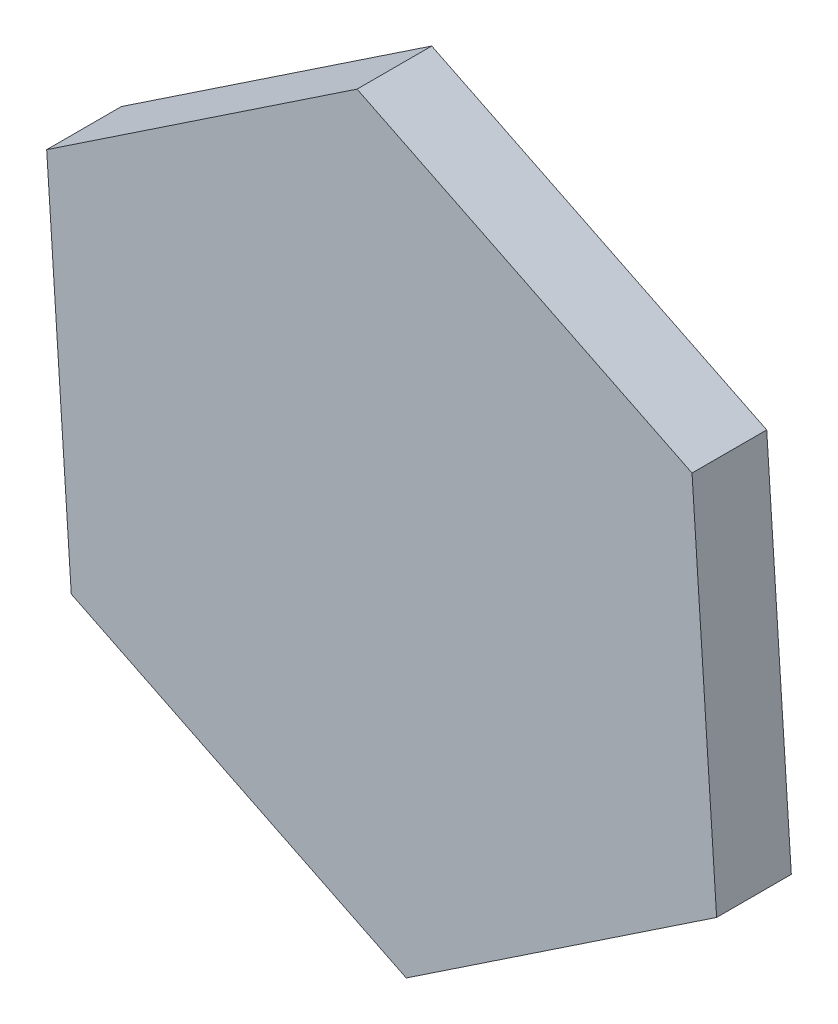
ISO-10303-21;
HEADER;
FILE_DESCRIPTION(('STEP AP214'),'2;1');
FILE_NAME('part.step','',(''),(''),'','','');
FILE_SCHEMA(('AUTOMOTIVE_DESIGN { 1 0 10303 214 1 1 1 1 }'));
ENDSEC;
DATA;
#1=APPLICATION_CONTEXT('core data for automotive mechanical design processes');
#2=APPLICATION_PROTOCOL_DEFINITION('international standard','automotive_design',2000,#1);
#3=PRODUCT_CONTEXT('',#1,'mechanical');
#4=PRODUCT('Part','Part','',(#3));
#5=PRODUCT_RELATED_PRODUCT_CATEGORY('part','',(#4));
#6=PRODUCT_DEFINITION_FORMATION('','',#4);
#7=PRODUCT_DEFINITION_CONTEXT('part definition',#1,'design');
#8=PRODUCT_DEFINITION('design','',#6,#7);
#9=PRODUCT_DEFINITION_SHAPE('','',#8);
#10=(LENGTH_UNIT() NAMED_UNIT(*) SI_UNIT(.MILLI.,.METRE.));
#11=(NAMED_UNIT(*) PLANE_ANGLE_UNIT() SI_UNIT($,.RADIAN.));
#12=(NAMED_UNIT(*) SI_UNIT($,.STERADIAN.) SOLID_ANGLE_UNIT());
#13=UNCERTAINTY_MEASURE_WITH_UNIT(LENGTH_MEASURE(1.E-05),#10,'distance_accuracy_value','');
#14=(GEOMETRIC_REPRESENTATION_CONTEXT(3) GLOBAL_UNCERTAINTY_ASSIGNED_CONTEXT((#13)) GLOBAL_UNIT_ASSIGNED_CONTEXT((#10,
#11,#12)) REPRESENTATION_CONTEXT('',''));
#15=CARTESIAN_POINT('',(0.,0.,0.));
#16=DIRECTION('',(0.,0.,1.));
#17=DIRECTION('',(1.,0.,0.));
#18=AXIS2_PLACEMENT_3D('',#15,#16,#17);
#19=CARTESIAN_POINT('',(67.2820031148955,-33.1380756358482,15.));
#20=DIRECTION('',(-0.997826156439031,-0.065901149656973,0.));
#21=DIRECTION('',(0.065901149656973,-0.997826156439031,0.));
#22=AXIS2_PLACEMENT_3D('',#19,#20,#21);
#23=PLANE('',#22);
#24=DIRECTION('',(-0.065901149656973,0.997826156439031,0.));
#25=VECTOR('',#24,1.);
#26=CARTESIAN_POINT('',(67.2820031148955,-33.1380756358482,0.));
#27=LINE('',#26,#25);
#28=CARTESIAN_POINT('',(67.2820031148955,-33.1380756358482,0.));
#29=VERTEX_POINT('',#28);
#30=CARTESIAN_POINT('',(62.3394168906225,41.6988860970791,0.));
#31=VERTEX_POINT('',#30);
#32=EDGE_CURVE('E118',#29,#31,#27,.T.);
#33=ORIENTED_EDGE('',*,*,#32,.T.);
#34=DIRECTION('',(0.,0.,-1.));
#35=VECTOR('',#34,1.);
#36=CARTESIAN_POINT('',(62.3394168906225,41.6988860970791,15.));
#37=LINE('',#36,#35);
#38=CARTESIAN_POINT('',(62.3394168906225,41.6988860970791,15.));
#39=VERTEX_POINT('',#38);
#40=EDGE_CURVE('E11',#39,#31,#37,.T.);
#41=ORIENTED_EDGE('',*,*,#40,.F.);
#42=DIRECTION('',(-0.065901149656973,0.997826156439031,0.));
#43=VECTOR('',#42,1.);
#44=CARTESIAN_POINT('',(67.2820031148955,-33.1380756358482,15.));
#45=LINE('',#44,#43);
#46=CARTESIAN_POINT('',(67.2820031148955,-33.1380756358482,15.));
#47=VERTEX_POINT('',#46);
#48=EDGE_CURVE('E128',#47,#39,#45,.T.);
#49=ORIENTED_EDGE('',*,*,#48,.F.);
#50=DIRECTION('',(0.,0.,-1.));
#51=VECTOR('',#50,1.);
#52=CARTESIAN_POINT('',(67.2820031148955,-33.1380756358482,15.));
#53=LINE('',#52,#51);
#54=EDGE_CURVE('E114',#47,#29,#53,.T.);
#55=ORIENTED_EDGE('',*,*,#54,.T.);
#56=EDGE_LOOP('',(#33,#41,#49,#55));
#57=FACE_BOUND('',#56,.T.);
#58=ADVANCED_FACE('F34',(#57),#23,.F.);
#59=CARTESIAN_POINT('',(62.3394168906225,41.6988860970791,15.));
#60=DIRECTION('',(-0.441841008477977,-0.897093374865273,0.));
#61=DIRECTION('',(0.897093374865273,-0.441841008477977,0.));
#62=AXIS2_PLACEMENT_3D('',#59,#60,#61);
#63=PLANE('',#62);
#64=DIRECTION('',(-0.897093374865273,0.441841008477977,0.));
#65=VECTOR('',#64,1.);
#66=CARTESIAN_POINT('',(62.3394168906225,41.6988860970791,0.));
#67=LINE('',#66,#65);
#68=CARTESIAN_POINT('',(-4.94258622427298,74.8369617329273,0.));
#69=VERTEX_POINT('',#68);
#70=EDGE_CURVE('E121',#31,#69,#67,.T.);
#71=ORIENTED_EDGE('',*,*,#70,.T.);
#72=DIRECTION('',(0.,0.,-1.));
#73=VECTOR('',#72,1.);
#74=CARTESIAN_POINT('',(-4.94258622427298,74.8369617329273,15.));
#75=LINE('',#74,#73);
#76=CARTESIAN_POINT('',(-4.94258622427298,74.8369617329273,15.));
#77=VERTEX_POINT('',#76);
#78=EDGE_CURVE('E42',#77,#69,#75,.T.);
#79=ORIENTED_EDGE('',*,*,#78,.F.);
#80=DIRECTION('',(-0.897093374865273,0.441841008477977,0.));
#81=VECTOR('',#80,1.);
#82=CARTESIAN_POINT('',(62.3394168906225,41.6988860970791,15.));
#83=LINE('',#82,#81);
#84=EDGE_CURVE('E87',#39,#77,#83,.T.);
#85=ORIENTED_EDGE('',*,*,#84,.F.);
#86=ORIENTED_EDGE('',*,*,#40,.T.);
#87=EDGE_LOOP('',(#71,#79,#85,#86));
#88=FACE_BOUND('',#87,.T.);
#89=ADVANCED_FACE('F152',(#88),#63,.F.);
#90=CARTESIAN_POINT('',(-4.94258622427298,74.8369617329273,15.));
#91=DIRECTION('',(0.555985147961055,-0.831192225208299,0.));
#92=DIRECTION('',(0.831192225208299,0.555985147961055,0.));
#93=AXIS2_PLACEMENT_3D('',#90,#91,#92);
#94=PLANE('',#93);
#95=DIRECTION('',(-0.831192225208299,-0.555985147961055,0.));
#96=VECTOR('',#95,1.);
#97=CARTESIAN_POINT('',(-4.94258622427298,74.8369617329273,0.));
#98=LINE('',#97,#96);
#99=CARTESIAN_POINT('',(-67.2820031148955,33.1380756358482,0.));
#100=VERTEX_POINT('',#99);
#101=EDGE_CURVE('E123',#69,#100,#98,.T.);
#102=ORIENTED_EDGE('',*,*,#101,.T.);
#103=DIRECTION('',(0.,0.,-1.));
#104=VECTOR('',#103,1.);
#105=CARTESIAN_POINT('',(-67.2820031148955,33.1380756358482,15.));
#106=LINE('',#105,#104);
#107=CARTESIAN_POINT('',(-67.2820031148955,33.1380756358482,15.));
#108=VERTEX_POINT('',#107);
#109=EDGE_CURVE('E109',#108,#100,#106,.T.);
#110=ORIENTED_EDGE('',*,*,#109,.F.);
#111=DIRECTION('',(-0.831192225208299,-0.555985147961055,0.));
#112=VECTOR('',#111,1.);
#113=CARTESIAN_POINT('',(-4.94258622427298,74.8369617329273,15.));
#114=LINE('',#113,#112);
#115=EDGE_CURVE('E100',#77,#108,#114,.T.);
#116=ORIENTED_EDGE('',*,*,#115,.F.);
#117=ORIENTED_EDGE('',*,*,#78,.T.);
#118=EDGE_LOOP('',(#102,#110,#116,#117));
#119=FACE_BOUND('',#118,.T.);
#120=ADVANCED_FACE('F134',(#119),#94,.F.);
#121=CARTESIAN_POINT('',(-67.2820031148955,33.1380756358482,15.));
#122=DIRECTION('',(0.997826156439031,0.0659011496569733,0.));
#123=DIRECTION('',(-0.0659011496569733,0.997826156439031,0.));
#124=AXIS2_PLACEMENT_3D('',#121,#122,#123);
#125=PLANE('',#124);
#126=DIRECTION('',(0.0659011496569733,-0.997826156439031,0.));
#127=VECTOR('',#126,1.);
#128=CARTESIAN_POINT('',(-67.2820031148955,33.1380756358482,0.));
#129=LINE('',#128,#127);
#130=CARTESIAN_POINT('',(-62.3394168906225,-41.6988860970791,0.));
#131=VERTEX_POINT('',#130);
#132=EDGE_CURVE('E108',#100,#131,#129,.T.);
#133=ORIENTED_EDGE('',*,*,#132,.T.);
#134=DIRECTION('',(0.,0.,-1.));
#135=VECTOR('',#134,1.);
#136=CARTESIAN_POINT('',(-62.3394168906225,-41.6988860970791,15.));
#137=LINE('',#136,#135);
#138=CARTESIAN_POINT('',(-62.3394168906225,-41.6988860970791,15.));
#139=VERTEX_POINT('',#138);
#140=EDGE_CURVE('E105',#139,#131,#137,.T.);
#141=ORIENTED_EDGE('',*,*,#140,.F.);
#142=DIRECTION('',(0.0659011496569733,-0.997826156439031,0.));
#143=VECTOR('',#142,1.);
#144=CARTESIAN_POINT('',(-67.2820031148955,33.1380756358482,15.));
#145=LINE('',#144,#143);
#146=EDGE_CURVE('E94',#108,#139,#145,.T.);
#147=ORIENTED_EDGE('',*,*,#146,.F.);
#148=ORIENTED_EDGE('',*,*,#109,.T.);
#149=EDGE_LOOP('',(#133,#141,#147,#148));
#150=FACE_BOUND('',#149,.T.);
#151=ADVANCED_FACE('F106',(#150),#125,.F.);
#152=CARTESIAN_POINT('',(-62.3394168906225,-41.6988860970791,15.));
#153=DIRECTION('',(0.441841008477976,0.897093374865273,0.));
#154=DIRECTION('',(-0.897093374865273,0.441841008477976,0.));
#155=AXIS2_PLACEMENT_3D('',#152,#153,#154);
#156=PLANE('',#155);
#157=DIRECTION('',(0.897093374865273,-0.441841008477976,0.));
#158=VECTOR('',#157,1.);
#159=CARTESIAN_POINT('',(-62.3394168906225,-41.6988860970791,0.));
#160=LINE('',#159,#158);
#161=CARTESIAN_POINT('',(4.94258622427302,-74.8369617329273,0.));
#162=VERTEX_POINT('',#161);
#163=EDGE_CURVE('E73',#131,#162,#160,.T.);
#164=ORIENTED_EDGE('',*,*,#163,.T.);
#165=DIRECTION('',(0.,0.,-1.));
#166=VECTOR('',#165,1.);
#167=CARTESIAN_POINT('',(4.94258622427302,-74.8369617329273,15.));
#168=LINE('',#167,#166);
#169=CARTESIAN_POINT('',(4.94258622427302,-74.8369617329273,15.));
#170=VERTEX_POINT('',#169);
#171=EDGE_CURVE('E110',#170,#162,#168,.T.);
#172=ORIENTED_EDGE('',*,*,#171,.F.);
#173=DIRECTION('',(0.897093374865273,-0.441841008477976,0.));
#174=VECTOR('',#173,1.);
#175=CARTESIAN_POINT('',(-62.3394168906225,-41.6988860970791,15.));
#176=LINE('',#175,#174);
#177=EDGE_CURVE('E98',#139,#170,#176,.T.);
#178=ORIENTED_EDGE('',*,*,#177,.F.);
#179=ORIENTED_EDGE('',*,*,#140,.T.);
#180=EDGE_LOOP('',(#164,#172,#178,#179));
#181=FACE_BOUND('',#180,.T.);
#182=ADVANCED_FACE('F112',(#181),#156,.F.);
#183=CARTESIAN_POINT('',(4.94258622427302,-74.8369617329273,15.));
#184=DIRECTION('',(-0.555985147961055,0.831192225208299,0.));
#185=DIRECTION('',(-0.831192225208299,-0.555985147961055,0.));
#186=AXIS2_PLACEMENT_3D('',#183,#184,#185);
#187=PLANE('',#186);
#188=DIRECTION('',(0.831192225208299,0.555985147961055,0.));
#189=VECTOR('',#188,1.);
#190=CARTESIAN_POINT('',(4.94258622427302,-74.8369617329273,0.));
#191=LINE('',#190,#189);
#192=EDGE_CURVE('E79',#162,#29,#191,.T.);
#193=ORIENTED_EDGE('',*,*,#192,.T.);
#194=ORIENTED_EDGE('',*,*,#54,.F.);
#195=DIRECTION('',(0.831192225208299,0.555985147961055,0.));
#196=VECTOR('',#195,1.);
#197=CARTESIAN_POINT('',(4.94258622427302,-74.8369617329273,15.));
#198=LINE('',#197,#196);
#199=EDGE_CURVE('E50',#170,#47,#198,.T.);
#200=ORIENTED_EDGE('',*,*,#199,.F.);
#201=ORIENTED_EDGE('',*,*,#171,.T.);
#202=EDGE_LOOP('',(#193,#194,#200,#201));
#203=FACE_BOUND('',#202,.T.);
#204=ADVANCED_FACE('F141',(#203),#187,.F.);
#205=CARTESIAN_POINT('',(0.,0.,15.));
#206=DIRECTION('',(0.,0.,1.));
#207=DIRECTION('',(1.,0.,0.));
#208=AXIS2_PLACEMENT_3D('',#205,#206,#207);
#209=PLANE('',#208);
#210=ORIENTED_EDGE('',*,*,#48,.T.);
#211=ORIENTED_EDGE('',*,*,#84,.T.);
#212=ORIENTED_EDGE('',*,*,#115,.T.);
#213=ORIENTED_EDGE('',*,*,#146,.T.);
#214=ORIENTED_EDGE('',*,*,#177,.T.);
#215=ORIENTED_EDGE('',*,*,#199,.T.);
#216=EDGE_LOOP('',(#210,#211,#212,#213,#214,#215));
#217=FACE_BOUND('',#216,.T.);
#218=ADVANCED_FACE('F96',(#217),#209,.T.);
#219=CARTESIAN_POINT('',(0.,0.,0.));
#220=DIRECTION('',(0.,0.,1.));
#221=DIRECTION('',(1.,0.,0.));
#222=AXIS2_PLACEMENT_3D('',#219,#220,#221);
#223=PLANE('',#222);
#224=ORIENTED_EDGE('',*,*,#32,.F.);
#225=ORIENTED_EDGE('',*,*,#192,.F.);
#226=ORIENTED_EDGE('',*,*,#163,.F.);
#227=ORIENTED_EDGE('',*,*,#132,.F.);
#228=ORIENTED_EDGE('',*,*,#101,.F.);
#229=ORIENTED_EDGE('',*,*,#70,.F.);
#230=EDGE_LOOP('',(#224,#225,#226,#227,#228,#229));
#231=FACE_BOUND('',#230,.T.);
#232=ADVANCED_FACE('F137',(#231),#223,.F.);
#233=CLOSED_SHELL('',(#58,#89,#120,#151,#182,#204,#218,#232));
#234=MANIFOLD_SOLID_BREP('B2',#233);
#235=ADVANCED_BREP_SHAPE_REPRESENTATION('',(#18,#234),#14);
#236=SHAPE_DEFINITION_REPRESENTATION(#9,#235);
ENDSEC;
END-ISO-10303-21;
